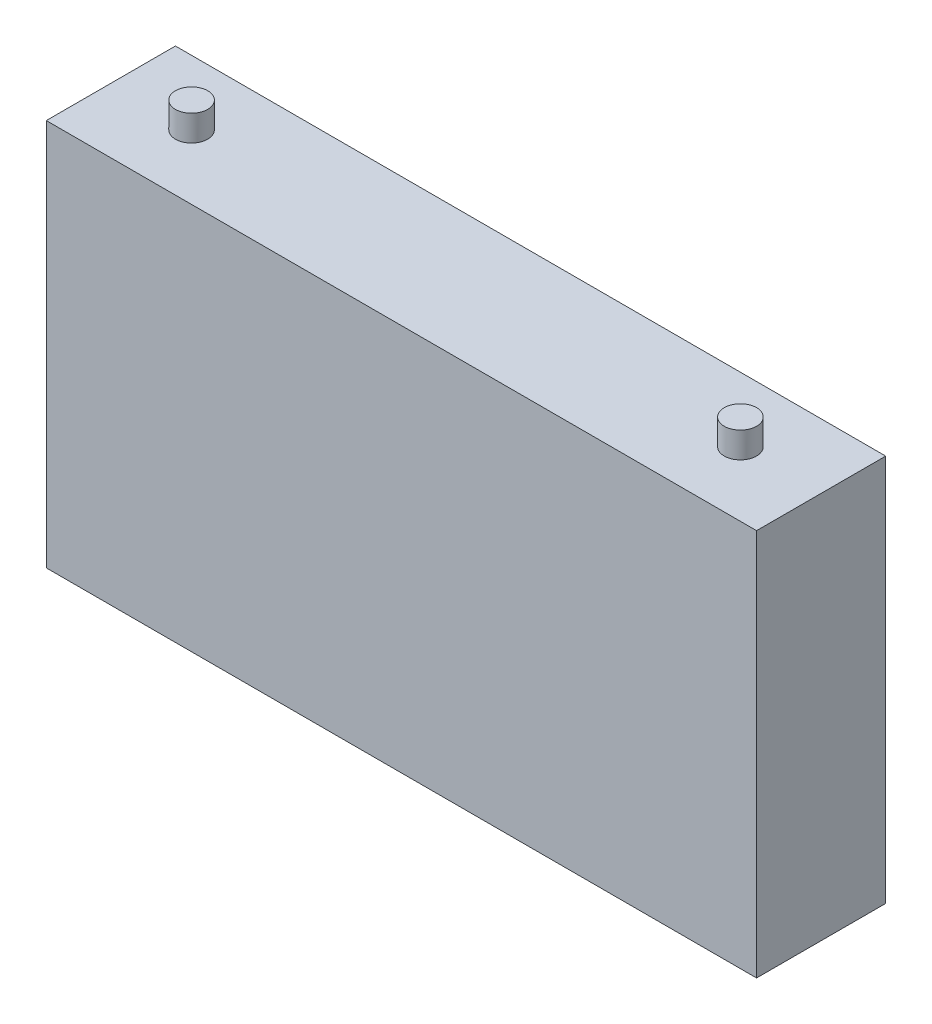
ISO-10303-21;
HEADER;
FILE_DESCRIPTION(('STEP AP214'),'2;1');
FILE_NAME('part.step','',(''),(''),'','','');
FILE_SCHEMA(('AUTOMOTIVE_DESIGN { 1 0 10303 214 1 1 1 1 }'));
ENDSEC;
DATA;
#1=APPLICATION_CONTEXT('core data for automotive mechanical design processes');
#2=APPLICATION_PROTOCOL_DEFINITION('international standard','automotive_design',2000,#1);
#3=PRODUCT_CONTEXT('',#1,'mechanical');
#4=PRODUCT('Part','Part','',(#3));
#5=PRODUCT_RELATED_PRODUCT_CATEGORY('part','',(#4));
#6=PRODUCT_DEFINITION_FORMATION('','',#4);
#7=PRODUCT_DEFINITION_CONTEXT('part definition',#1,'design');
#8=PRODUCT_DEFINITION('design','',#6,#7);
#9=PRODUCT_DEFINITION_SHAPE('','',#8);
#10=(LENGTH_UNIT() NAMED_UNIT(*) SI_UNIT(.MILLI.,.METRE.));
#11=(NAMED_UNIT(*) PLANE_ANGLE_UNIT() SI_UNIT($,.RADIAN.));
#12=(NAMED_UNIT(*) SI_UNIT($,.STERADIAN.) SOLID_ANGLE_UNIT());
#13=UNCERTAINTY_MEASURE_WITH_UNIT(LENGTH_MEASURE(1.E-05),#10,'distance_accuracy_value','');
#14=(GEOMETRIC_REPRESENTATION_CONTEXT(3) GLOBAL_UNCERTAINTY_ASSIGNED_CONTEXT((#13)) GLOBAL_UNIT_ASSIGNED_CONTEXT((#10,
#11,#12)) REPRESENTATION_CONTEXT('',''));
#15=CARTESIAN_POINT('',(0.,0.,0.));
#16=DIRECTION('',(0.,0.,1.));
#17=DIRECTION('',(1.,0.,0.));
#18=AXIS2_PLACEMENT_3D('',#15,#16,#17);
#19=CARTESIAN_POINT('',(110.,-60.,20.));
#20=DIRECTION('',(-1.,0.,0.));
#21=DIRECTION('',(0.,0.,1.));
#22=AXIS2_PLACEMENT_3D('',#19,#20,#21);
#23=PLANE('',#22);
#24=DIRECTION('',(0.,1.,0.));
#25=VECTOR('',#24,1.);
#26=CARTESIAN_POINT('',(110.,-60.,-20.));
#27=LINE('',#26,#25);
#28=CARTESIAN_POINT('',(110.,-60.,-20.));
#29=VERTEX_POINT('',#28);
#30=CARTESIAN_POINT('',(110.,60.,-20.));
#31=VERTEX_POINT('',#30);
#32=EDGE_CURVE('E106',#29,#31,#27,.T.);
#33=ORIENTED_EDGE('',*,*,#32,.T.);
#34=DIRECTION('',(0.,0.,-1.));
#35=VECTOR('',#34,1.);
#36=CARTESIAN_POINT('',(110.,60.,20.));
#37=LINE('',#36,#35);
#38=CARTESIAN_POINT('',(110.,60.,20.));
#39=VERTEX_POINT('',#38);
#40=EDGE_CURVE('E97',#39,#31,#37,.T.);
#41=ORIENTED_EDGE('',*,*,#40,.F.);
#42=DIRECTION('',(0.,1.,0.));
#43=VECTOR('',#42,1.);
#44=CARTESIAN_POINT('',(110.,-60.,20.));
#45=LINE('',#44,#43);
#46=CARTESIAN_POINT('',(110.,-60.,20.));
#47=VERTEX_POINT('',#46);
#48=EDGE_CURVE('E91',#47,#39,#45,.T.);
#49=ORIENTED_EDGE('',*,*,#48,.F.);
#50=DIRECTION('',(0.,0.,-1.));
#51=VECTOR('',#50,1.);
#52=CARTESIAN_POINT('',(110.,-60.,20.));
#53=LINE('',#52,#51);
#54=EDGE_CURVE('E102',#47,#29,#53,.T.);
#55=ORIENTED_EDGE('',*,*,#54,.T.);
#56=EDGE_LOOP('',(#33,#41,#49,#55));
#57=FACE_BOUND('',#56,.T.);
#58=ADVANCED_FACE('F39',(#57),#23,.F.);
#59=CARTESIAN_POINT('',(-110.,60.,20.));
#60=DIRECTION('',(0.,-1.,0.));
#61=DIRECTION('',(0.,0.,-1.));
#62=AXIS2_PLACEMENT_3D('',#59,#60,#61);
#63=PLANE('',#62);
#64=CARTESIAN_POINT('',(-85.,60.,0.));
#65=DIRECTION('',(0.,-1.,0.));
#66=DIRECTION('',(0.,0.,-1.));
#67=AXIS2_PLACEMENT_3D('',#64,#65,#66);
#68=CIRCLE('',#67,5.);
#69=CARTESIAN_POINT('',(-85.,60.,-5.));
#70=VERTEX_POINT('',#69);
#71=EDGE_CURVE('E11',#70,#70,#68,.F.);
#72=ORIENTED_EDGE('',*,*,#71,.F.);
#73=EDGE_LOOP('',(#72));
#74=FACE_BOUND('',#73,.T.);
#75=CARTESIAN_POINT('',(85.,60.,0.));
#76=DIRECTION('',(0.,-1.,0.));
#77=DIRECTION('',(0.,0.,-1.));
#78=AXIS2_PLACEMENT_3D('',#75,#76,#77);
#79=CIRCLE('',#78,5.);
#80=CARTESIAN_POINT('',(85.,60.,-5.));
#81=VERTEX_POINT('',#80);
#82=EDGE_CURVE('E47',#81,#81,#79,.F.);
#83=ORIENTED_EDGE('',*,*,#82,.F.);
#84=EDGE_LOOP('',(#83));
#85=FACE_BOUND('',#84,.T.);
#86=DIRECTION('',(-1.,0.,0.));
#87=VECTOR('',#86,1.);
#88=CARTESIAN_POINT('',(-110.,60.,-20.));
#89=LINE('',#88,#87);
#90=CARTESIAN_POINT('',(-110.,60.,-20.));
#91=VERTEX_POINT('',#90);
#92=EDGE_CURVE('E96',#31,#91,#89,.T.);
#93=ORIENTED_EDGE('',*,*,#92,.T.);
#94=DIRECTION('',(0.,0.,-1.));
#95=VECTOR('',#94,1.);
#96=CARTESIAN_POINT('',(-110.,60.,20.));
#97=LINE('',#96,#95);
#98=CARTESIAN_POINT('',(-110.,60.,20.));
#99=VERTEX_POINT('',#98);
#100=EDGE_CURVE('E94',#99,#91,#97,.T.);
#101=ORIENTED_EDGE('',*,*,#100,.F.);
#102=DIRECTION('',(-1.,0.,0.));
#103=VECTOR('',#102,1.);
#104=CARTESIAN_POINT('',(-110.,60.,20.));
#105=LINE('',#104,#103);
#106=EDGE_CURVE('E86',#39,#99,#105,.T.);
#107=ORIENTED_EDGE('',*,*,#106,.F.);
#108=ORIENTED_EDGE('',*,*,#40,.T.);
#109=EDGE_LOOP('',(#93,#101,#107,#108));
#110=FACE_BOUND('',#109,.T.);
#111=ADVANCED_FACE('F95',(#74,#85,#110),#63,.F.);
#112=CARTESIAN_POINT('',(-110.,-60.,20.));
#113=DIRECTION('',(1.,0.,0.));
#114=DIRECTION('',(0.,0.,-1.));
#115=AXIS2_PLACEMENT_3D('',#112,#113,#114);
#116=PLANE('',#115);
#117=DIRECTION('',(0.,-1.,0.));
#118=VECTOR('',#117,1.);
#119=CARTESIAN_POINT('',(-110.,-60.,-20.));
#120=LINE('',#119,#118);
#121=CARTESIAN_POINT('',(-110.,-60.,-20.));
#122=VERTEX_POINT('',#121);
#123=EDGE_CURVE('E72',#91,#122,#120,.T.);
#124=ORIENTED_EDGE('',*,*,#123,.T.);
#125=DIRECTION('',(0.,0.,-1.));
#126=VECTOR('',#125,1.);
#127=CARTESIAN_POINT('',(-110.,-60.,20.));
#128=LINE('',#127,#126);
#129=CARTESIAN_POINT('',(-110.,-60.,20.));
#130=VERTEX_POINT('',#129);
#131=EDGE_CURVE('E98',#130,#122,#128,.T.);
#132=ORIENTED_EDGE('',*,*,#131,.F.);
#133=DIRECTION('',(0.,-1.,0.));
#134=VECTOR('',#133,1.);
#135=CARTESIAN_POINT('',(-110.,-60.,20.));
#136=LINE('',#135,#134);
#137=EDGE_CURVE('E89',#99,#130,#136,.T.);
#138=ORIENTED_EDGE('',*,*,#137,.F.);
#139=ORIENTED_EDGE('',*,*,#100,.T.);
#140=EDGE_LOOP('',(#124,#132,#138,#139));
#141=FACE_BOUND('',#140,.T.);
#142=ADVANCED_FACE('F100',(#141),#116,.F.);
#143=CARTESIAN_POINT('',(-110.,-60.,20.));
#144=DIRECTION('',(0.,1.,0.));
#145=DIRECTION('',(0.,0.,1.));
#146=AXIS2_PLACEMENT_3D('',#143,#144,#145);
#147=PLANE('',#146);
#148=CARTESIAN_POINT('',(-85.,-60.,0.));
#149=DIRECTION('',(0.,1.,0.));
#150=DIRECTION('',(0.,0.,1.));
#151=AXIS2_PLACEMENT_3D('',#148,#149,#150);
#152=CIRCLE('',#151,5.);
#153=CARTESIAN_POINT('',(-85.,-60.,5.));
#154=VERTEX_POINT('',#153);
#155=EDGE_CURVE('E178',#154,#154,#152,.T.);
#156=ORIENTED_EDGE('',*,*,#155,.T.);
#157=EDGE_LOOP('',(#156));
#158=FACE_BOUND('',#157,.T.);
#159=CARTESIAN_POINT('',(85.,-60.,0.));
#160=DIRECTION('',(0.,1.,0.));
#161=DIRECTION('',(0.,0.,1.));
#162=AXIS2_PLACEMENT_3D('',#159,#160,#161);
#163=CIRCLE('',#162,5.);
#164=CARTESIAN_POINT('',(85.,-60.,5.));
#165=VERTEX_POINT('',#164);
#166=EDGE_CURVE('E179',#165,#165,#163,.T.);
#167=ORIENTED_EDGE('',*,*,#166,.T.);
#168=EDGE_LOOP('',(#167));
#169=FACE_BOUND('',#168,.T.);
#170=DIRECTION('',(1.,0.,0.));
#171=VECTOR('',#170,1.);
#172=CARTESIAN_POINT('',(-110.,-60.,-20.));
#173=LINE('',#172,#171);
#174=EDGE_CURVE('E78',#122,#29,#173,.T.);
#175=ORIENTED_EDGE('',*,*,#174,.T.);
#176=ORIENTED_EDGE('',*,*,#54,.F.);
#177=DIRECTION('',(1.,0.,0.));
#178=VECTOR('',#177,1.);
#179=CARTESIAN_POINT('',(-110.,-60.,20.));
#180=LINE('',#179,#178);
#181=EDGE_CURVE('E55',#130,#47,#180,.T.);
#182=ORIENTED_EDGE('',*,*,#181,.F.);
#183=ORIENTED_EDGE('',*,*,#131,.T.);
#184=EDGE_LOOP('',(#175,#176,#182,#183));
#185=FACE_BOUND('',#184,.T.);
#186=ADVANCED_FACE('F127',(#158,#169,#185),#147,.F.);
#187=CARTESIAN_POINT('',(0.,0.,20.));
#188=DIRECTION('',(0.,0.,-1.));
#189=DIRECTION('',(-1.,0.,0.));
#190=AXIS2_PLACEMENT_3D('',#187,#188,#189);
#191=PLANE('',#190);
#192=ORIENTED_EDGE('',*,*,#48,.T.);
#193=ORIENTED_EDGE('',*,*,#106,.T.);
#194=ORIENTED_EDGE('',*,*,#137,.T.);
#195=ORIENTED_EDGE('',*,*,#181,.T.);
#196=EDGE_LOOP('',(#192,#193,#194,#195));
#197=FACE_BOUND('',#196,.T.);
#198=ADVANCED_FACE('F87',(#197),#191,.F.);
#199=CARTESIAN_POINT('',(0.,0.,-20.));
#200=DIRECTION('',(0.,0.,-1.));
#201=DIRECTION('',(-1.,0.,0.));
#202=AXIS2_PLACEMENT_3D('',#199,#200,#201);
#203=PLANE('',#202);
#204=ORIENTED_EDGE('',*,*,#32,.F.);
#205=ORIENTED_EDGE('',*,*,#174,.F.);
#206=ORIENTED_EDGE('',*,*,#123,.F.);
#207=ORIENTED_EDGE('',*,*,#92,.F.);
#208=EDGE_LOOP('',(#204,#205,#206,#207));
#209=FACE_BOUND('',#208,.T.);
#210=ADVANCED_FACE('F136',(#209),#203,.T.);
#211=CARTESIAN_POINT('',(85.,68.,0.));
#212=DIRECTION('',(0.,-1.,0.));
#213=DIRECTION('',(0.,0.,-1.));
#214=AXIS2_PLACEMENT_3D('',#211,#212,#213);
#215=CYLINDRICAL_SURFACE('',#214,5.);
#216=CARTESIAN_POINT('',(85.,68.,0.));
#217=DIRECTION('',(0.,1.,0.));
#218=DIRECTION('',(0.,0.,1.));
#219=AXIS2_PLACEMENT_3D('',#216,#217,#218);
#220=CIRCLE('',#219,5.);
#221=CARTESIAN_POINT('',(85.,68.,5.));
#222=VERTEX_POINT('',#221);
#223=EDGE_CURVE('E109',#222,#222,#220,.T.);
#224=ORIENTED_EDGE('',*,*,#223,.F.);
#225=EDGE_LOOP('',(#224));
#226=FACE_BOUND('',#225,.T.);
#227=ORIENTED_EDGE('',*,*,#82,.T.);
#228=EDGE_LOOP('',(#227));
#229=FACE_BOUND('',#228,.T.);
#230=ADVANCED_FACE('F118',(#226,#229),#215,.T.);
#231=CARTESIAN_POINT('',(85.,68.,0.));
#232=DIRECTION('',(0.,1.,0.));
#233=DIRECTION('',(0.,0.,1.));
#234=AXIS2_PLACEMENT_3D('',#231,#232,#233);
#235=PLANE('',#234);
#236=ORIENTED_EDGE('',*,*,#223,.T.);
#237=EDGE_LOOP('',(#236));
#238=FACE_BOUND('',#237,.T.);
#239=ADVANCED_FACE('F142',(#238),#235,.T.);
#240=CARTESIAN_POINT('',(-85.,68.,0.));
#241=DIRECTION('',(0.,-1.,0.));
#242=DIRECTION('',(0.,0.,-1.));
#243=AXIS2_PLACEMENT_3D('',#240,#241,#242);
#244=CYLINDRICAL_SURFACE('',#243,5.);
#245=CARTESIAN_POINT('',(-85.,68.,0.));
#246=DIRECTION('',(0.,1.,0.));
#247=DIRECTION('',(0.,0.,1.));
#248=AXIS2_PLACEMENT_3D('',#245,#246,#247);
#249=CIRCLE('',#248,5.);
#250=CARTESIAN_POINT('',(-85.,68.,5.));
#251=VERTEX_POINT('',#250);
#252=EDGE_CURVE('E187',#251,#251,#249,.T.);
#253=ORIENTED_EDGE('',*,*,#252,.F.);
#254=EDGE_LOOP('',(#253));
#255=FACE_BOUND('',#254,.T.);
#256=ORIENTED_EDGE('',*,*,#71,.T.);
#257=EDGE_LOOP('',(#256));
#258=FACE_BOUND('',#257,.T.);
#259=ADVANCED_FACE('F146',(#255,#258),#244,.T.);
#260=CARTESIAN_POINT('',(-85.,68.,0.));
#261=DIRECTION('',(0.,1.,0.));
#262=DIRECTION('',(0.,0.,1.));
#263=AXIS2_PLACEMENT_3D('',#260,#261,#262);
#264=PLANE('',#263);
#265=ORIENTED_EDGE('',*,*,#252,.T.);
#266=EDGE_LOOP('',(#265));
#267=FACE_BOUND('',#266,.T.);
#268=ADVANCED_FACE('F148',(#267),#264,.T.);
#269=CARTESIAN_POINT('',(85.,-68.,0.));
#270=DIRECTION('',(0.,1.,0.));
#271=DIRECTION('',(0.,0.,1.));
#272=AXIS2_PLACEMENT_3D('',#269,#270,#271);
#273=CYLINDRICAL_SURFACE('',#272,5.);
#274=CARTESIAN_POINT('',(85.,-68.,0.));
#275=DIRECTION('',(0.,1.,0.));
#276=DIRECTION('',(0.,0.,1.));
#277=AXIS2_PLACEMENT_3D('',#274,#275,#276);
#278=CIRCLE('',#277,5.);
#279=CARTESIAN_POINT('',(85.,-68.,5.));
#280=VERTEX_POINT('',#279);
#281=EDGE_CURVE('E182',#280,#280,#278,.T.);
#282=ORIENTED_EDGE('',*,*,#281,.T.);
#283=EDGE_LOOP('',(#282));
#284=FACE_BOUND('',#283,.T.);
#285=ORIENTED_EDGE('',*,*,#166,.F.);
#286=EDGE_LOOP('',(#285));
#287=FACE_BOUND('',#286,.T.);
#288=ADVANCED_FACE('F151',(#284,#287),#273,.T.);
#289=CARTESIAN_POINT('',(85.,-68.,0.));
#290=DIRECTION('',(0.,1.,0.));
#291=DIRECTION('',(0.,0.,1.));
#292=AXIS2_PLACEMENT_3D('',#289,#290,#291);
#293=PLANE('',#292);
#294=ORIENTED_EDGE('',*,*,#281,.F.);
#295=EDGE_LOOP('',(#294));
#296=FACE_BOUND('',#295,.T.);
#297=ADVANCED_FACE('F158',(#296),#293,.F.);
#298=CARTESIAN_POINT('',(-85.,-68.,0.));
#299=DIRECTION('',(0.,1.,0.));
#300=DIRECTION('',(0.,0.,1.));
#301=AXIS2_PLACEMENT_3D('',#298,#299,#300);
#302=CYLINDRICAL_SURFACE('',#301,5.);
#303=CARTESIAN_POINT('',(-85.,-68.,0.));
#304=DIRECTION('',(0.,1.,0.));
#305=DIRECTION('',(0.,0.,1.));
#306=AXIS2_PLACEMENT_3D('',#303,#304,#305);
#307=CIRCLE('',#306,5.);
#308=CARTESIAN_POINT('',(-85.,-68.,5.));
#309=VERTEX_POINT('',#308);
#310=EDGE_CURVE('E175',#309,#309,#307,.T.);
#311=ORIENTED_EDGE('',*,*,#310,.T.);
#312=EDGE_LOOP('',(#311));
#313=FACE_BOUND('',#312,.T.);
#314=ORIENTED_EDGE('',*,*,#155,.F.);
#315=EDGE_LOOP('',(#314));
#316=FACE_BOUND('',#315,.T.);
#317=ADVANCED_FACE('F162',(#313,#316),#302,.T.);
#318=CARTESIAN_POINT('',(-85.,-68.,0.));
#319=DIRECTION('',(0.,1.,0.));
#320=DIRECTION('',(0.,0.,1.));
#321=AXIS2_PLACEMENT_3D('',#318,#319,#320);
#322=PLANE('',#321);
#323=ORIENTED_EDGE('',*,*,#310,.F.);
#324=EDGE_LOOP('',(#323));
#325=FACE_BOUND('',#324,.T.);
#326=ADVANCED_FACE('F164',(#325),#322,.F.);
#327=CLOSED_SHELL('',(#58,#111,#142,#186,#198,#210,#230,#239,#259,#268,#288,#297,#317,#326));
#328=MANIFOLD_SOLID_BREP('B2',#327);
#329=ADVANCED_BREP_SHAPE_REPRESENTATION('',(#18,#328),#14);
#330=SHAPE_DEFINITION_REPRESENTATION(#9,#329);
ENDSEC;
END-ISO-10303-21;
